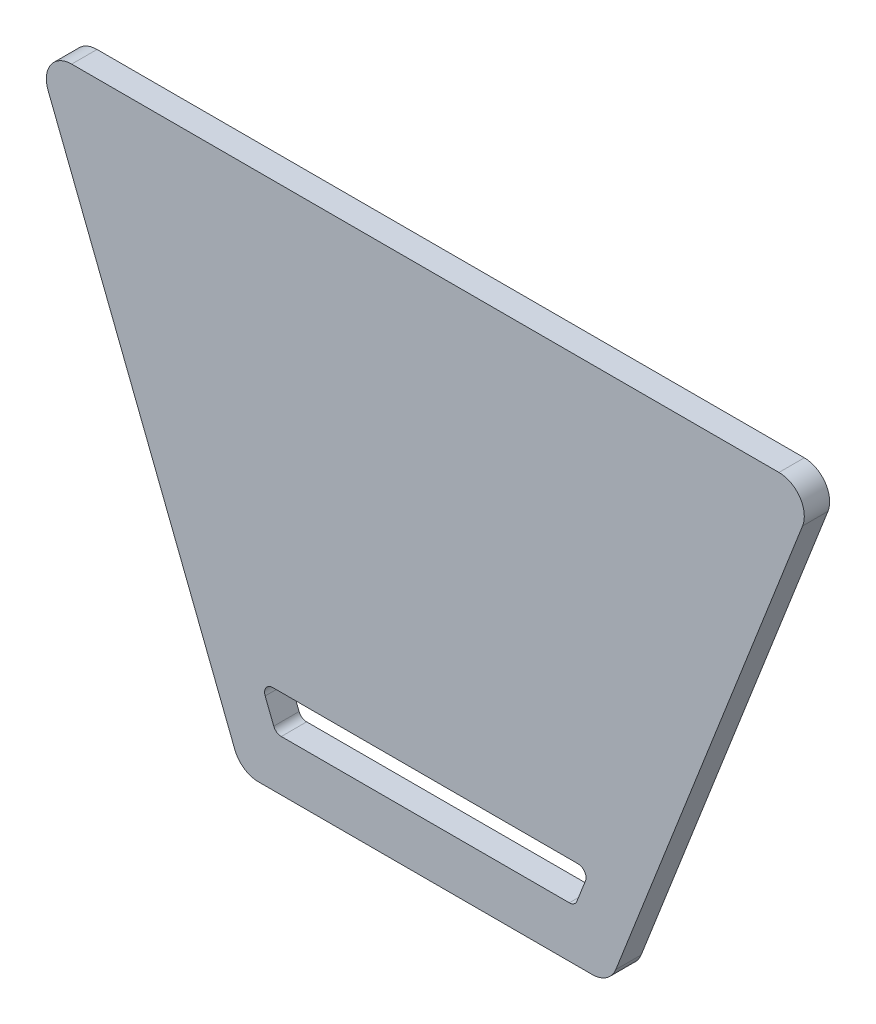
ISO-10303-21;
HEADER;
FILE_DESCRIPTION(('STEP AP214'),'2;1');
FILE_NAME('part.step','',(''),(''),'','','');
FILE_SCHEMA(('AUTOMOTIVE_DESIGN { 1 0 10303 214 1 1 1 1 }'));
ENDSEC;
DATA;
#1=APPLICATION_CONTEXT('core data for automotive mechanical design processes');
#2=APPLICATION_PROTOCOL_DEFINITION('international standard','automotive_design',2000,#1);
#3=PRODUCT_CONTEXT('',#1,'mechanical');
#4=PRODUCT('Part','Part','',(#3));
#5=PRODUCT_RELATED_PRODUCT_CATEGORY('part','',(#4));
#6=PRODUCT_DEFINITION_FORMATION('','',#4);
#7=PRODUCT_DEFINITION_CONTEXT('part definition',#1,'design');
#8=PRODUCT_DEFINITION('design','',#6,#7);
#9=PRODUCT_DEFINITION_SHAPE('','',#8);
#10=(LENGTH_UNIT() NAMED_UNIT(*) SI_UNIT(.MILLI.,.METRE.));
#11=(NAMED_UNIT(*) PLANE_ANGLE_UNIT() SI_UNIT($,.RADIAN.));
#12=(NAMED_UNIT(*) SI_UNIT($,.STERADIAN.) SOLID_ANGLE_UNIT());
#13=UNCERTAINTY_MEASURE_WITH_UNIT(LENGTH_MEASURE(1.E-05),#10,'distance_accuracy_value','');
#14=(GEOMETRIC_REPRESENTATION_CONTEXT(3) GLOBAL_UNCERTAINTY_ASSIGNED_CONTEXT((#13)) GLOBAL_UNIT_ASSIGNED_CONTEXT((#10,
#11,#12)) REPRESENTATION_CONTEXT('',''));
#15=CARTESIAN_POINT('',(0.,0.,0.));
#16=DIRECTION('',(0.,0.,1.));
#17=DIRECTION('',(1.,0.,0.));
#18=AXIS2_PLACEMENT_3D('',#15,#16,#17);
#19=CARTESIAN_POINT('',(2.64081387947168,3.17499999999996,-3.175));
#20=DIRECTION('',(0.,0.,1.));
#21=DIRECTION('',(1.,0.,0.));
#22=AXIS2_PLACEMENT_3D('',#19,#20,#21);
#23=PLANE('',#22);
#24=CARTESIAN_POINT('',(2.64081387947168,3.17499999999996,-3.175));
#25=DIRECTION('',(0.,0.,1.));
#26=DIRECTION('',(1.,0.,0.));
#27=AXIS2_PLACEMENT_3D('',#24,#25,#26);
#28=CIRCLE('',#27,3.175);
#29=CARTESIAN_POINT('',(2.64081387947167,0.,-3.175));
#30=VERTEX_POINT('',#29);
#31=CARTESIAN_POINT('',(5.59773660978438,2.01861210359144,-3.175));
#32=VERTEX_POINT('',#31);
#33=EDGE_CURVE('E240',#30,#32,#28,.T.);
#34=ORIENTED_EDGE('',*,*,#33,.F.);
#35=DIRECTION('',(1.,0.,0.));
#36=VECTOR('',#35,1.);
#37=CARTESIAN_POINT('',(-18.2570910649843,0.,-3.175));
#38=LINE('',#37,#36);
#39=CARTESIAN_POINT('',(-39.1549960094402,0.,-3.175));
#40=VERTEX_POINT('',#39);
#41=EDGE_CURVE('E252',#40,#30,#38,.T.);
#42=ORIENTED_EDGE('',*,*,#41,.F.);
#43=CARTESIAN_POINT('',(-39.1549960094402,3.17499999999996,-3.175));
#44=DIRECTION('',(0.,0.,-1.));
#45=DIRECTION('',(-1.,0.,0.));
#46=AXIS2_PLACEMENT_3D('',#43,#44,#45);
#47=CIRCLE('',#46,3.175);
#48=CARTESIAN_POINT('',(-42.1119187397529,2.01861210359144,-3.175));
#49=VERTEX_POINT('',#48);
#50=EDGE_CURVE('E212',#40,#49,#47,.T.);
#51=ORIENTED_EDGE('',*,*,#50,.T.);
#52=DIRECTION('',(-0.364216660286154,0.931314245767775,0.));
#53=VECTOR('',#52,1.);
#54=CARTESIAN_POINT('',(-65.4972345321023,61.815650827965,-3.175));
#55=LINE('',#54,#53);
#56=CARTESIAN_POINT('',(-65.4972345321023,61.815650827965,-3.175));
#57=VERTEX_POINT('',#56);
#58=EDGE_CURVE('E215',#49,#57,#55,.T.);
#59=ORIENTED_EDGE('',*,*,#58,.T.);
#60=CARTESIAN_POINT('',(-62.5403118017896,62.9720387243736,-3.175));
#61=DIRECTION('',(0.,0.,-1.));
#62=DIRECTION('',(1.,0.,0.));
#63=AXIS2_PLACEMENT_3D('',#60,#61,#62);
#64=CIRCLE('',#63,3.175);
#65=CARTESIAN_POINT('',(-62.5403118017896,66.1470387243736,-3.175));
#66=VERTEX_POINT('',#65);
#67=EDGE_CURVE('E218',#57,#66,#64,.T.);
#68=ORIENTED_EDGE('',*,*,#67,.T.);
#69=DIRECTION('',(-1.,0.,0.));
#70=VECTOR('',#69,1.);
#71=CARTESIAN_POINT('',(-18.2570910649843,66.1470387243736,-3.175));
#72=LINE('',#71,#70);
#73=CARTESIAN_POINT('',(26.0261296718211,66.1470387243736,-3.175));
#74=VERTEX_POINT('',#73);
#75=EDGE_CURVE('E250',#74,#66,#72,.T.);
#76=ORIENTED_EDGE('',*,*,#75,.F.);
#77=CARTESIAN_POINT('',(26.0261296718211,62.9720387243736,-3.175));
#78=DIRECTION('',(0.,0.,1.));
#79=DIRECTION('',(-1.,0.,0.));
#80=AXIS2_PLACEMENT_3D('',#77,#78,#79);
#81=CIRCLE('',#80,3.175);
#82=CARTESIAN_POINT('',(28.9830524021338,61.815650827965,-3.175));
#83=VERTEX_POINT('',#82);
#84=EDGE_CURVE('E247',#83,#74,#81,.T.);
#85=ORIENTED_EDGE('',*,*,#84,.F.);
#86=DIRECTION('',(0.364216660286154,0.931314245767775,0.));
#87=VECTOR('',#86,1.);
#88=CARTESIAN_POINT('',(28.9830524021338,61.815650827965,-3.175));
#89=LINE('',#88,#87);
#90=EDGE_CURVE('E243',#32,#83,#89,.T.);
#91=ORIENTED_EDGE('',*,*,#90,.F.);
#92=EDGE_LOOP('',(#34,#42,#51,#59,#68,#76,#85,#91));
#93=FACE_BOUND('',#92,.T.);
#94=CARTESIAN_POINT('',(-36.2939123431595,7.366,-3.175));
#95=DIRECTION('',(0.,0.,-1.));
#96=DIRECTION('',(-1.,0.,0.));
#97=AXIS2_PLACEMENT_3D('',#94,#95,#96);
#98=CIRCLE('',#97,1.016);
#99=CARTESIAN_POINT('',(-36.2939123431595,6.35,-3.175));
#100=VERTEX_POINT('',#99);
#101=CARTESIAN_POINT('',(-37.2401276168596,6.99595587314927,-3.175));
#102=VERTEX_POINT('',#101);
#103=EDGE_CURVE('E144',#100,#102,#98,.T.);
#104=ORIENTED_EDGE('',*,*,#103,.F.);
#105=DIRECTION('',(1.,0.,0.));
#106=VECTOR('',#105,1.);
#107=CARTESIAN_POINT('',(-36.2939123431595,6.35,-3.175));
#108=LINE('',#107,#106);
#109=CARTESIAN_POINT('',(-0.22026978680902,6.35,-3.175));
#110=VERTEX_POINT('',#109);
#111=EDGE_CURVE('E179',#100,#110,#108,.T.);
#112=ORIENTED_EDGE('',*,*,#111,.T.);
#113=CARTESIAN_POINT('',(-0.22026978680902,7.366,-3.175));
#114=DIRECTION('',(0.,0.,1.));
#115=DIRECTION('',(1.,0.,0.));
#116=AXIS2_PLACEMENT_3D('',#113,#114,#115);
#117=CIRCLE('',#116,1.016);
#118=CARTESIAN_POINT('',(0.725945486891039,6.99595587314927,-3.175));
#119=VERTEX_POINT('',#118);
#120=EDGE_CURVE('E48',#110,#119,#117,.T.);
#121=ORIENTED_EDGE('',*,*,#120,.T.);
#122=DIRECTION('',(0.364216660286153,0.931314245767776,0.));
#123=VECTOR('',#122,1.);
#124=CARTESIAN_POINT('',(0.72594548689104,6.99595587314927,-3.175));
#125=LINE('',#124,#123);
#126=CARTESIAN_POINT('',(1.79875109148404,9.73915587314927,-3.175));
#127=VERTEX_POINT('',#126);
#128=EDGE_CURVE('E175',#119,#127,#125,.T.);
#129=ORIENTED_EDGE('',*,*,#128,.T.);
#130=CARTESIAN_POINT('',(0.852535817783985,10.1092,-3.175));
#131=DIRECTION('',(0.,0.,1.));
#132=DIRECTION('',(1.,0.,0.));
#133=AXIS2_PLACEMENT_3D('',#130,#131,#132);
#134=CIRCLE('',#133,1.016);
#135=CARTESIAN_POINT('',(0.852535817783985,11.1252,-3.175));
#136=VERTEX_POINT('',#135);
#137=EDGE_CURVE('E172',#127,#136,#134,.T.);
#138=ORIENTED_EDGE('',*,*,#137,.T.);
#139=DIRECTION('',(-1.,0.,0.));
#140=VECTOR('',#139,1.);
#141=CARTESIAN_POINT('',(0.852535817783985,11.1252,-3.175));
#142=LINE('',#141,#140);
#143=CARTESIAN_POINT('',(-37.3667179477525,11.1252,-3.175));
#144=VERTEX_POINT('',#143);
#145=EDGE_CURVE('E168',#136,#144,#142,.T.);
#146=ORIENTED_EDGE('',*,*,#145,.T.);
#147=CARTESIAN_POINT('',(-37.3667179477525,10.1092,-3.175));
#148=DIRECTION('',(0.,0.,-1.));
#149=DIRECTION('',(-1.,0.,0.));
#150=AXIS2_PLACEMENT_3D('',#147,#148,#149);
#151=CIRCLE('',#150,1.016);
#152=CARTESIAN_POINT('',(-38.3129332214526,9.73915587314927,-3.175));
#153=VERTEX_POINT('',#152);
#154=EDGE_CURVE('E166',#153,#144,#151,.T.);
#155=ORIENTED_EDGE('',*,*,#154,.F.);
#156=DIRECTION('',(-0.364216660286153,0.931314245767776,0.));
#157=VECTOR('',#156,1.);
#158=CARTESIAN_POINT('',(-37.2401276168596,6.99595587314927,-3.175));
#159=LINE('',#158,#157);
#160=EDGE_CURVE('E153',#102,#153,#159,.T.);
#161=ORIENTED_EDGE('',*,*,#160,.F.);
#162=EDGE_LOOP('',(#104,#112,#121,#129,#138,#146,#155,#161));
#163=FACE_BOUND('',#162,.T.);
#164=ADVANCED_FACE('F31',(#93,#163),#23,.F.);
#165=CARTESIAN_POINT('',(2.64081387947168,3.17499999999996,0.));
#166=DIRECTION('',(0.,0.,1.));
#167=DIRECTION('',(1.,0.,0.));
#168=AXIS2_PLACEMENT_3D('',#165,#166,#167);
#169=PLANE('',#168);
#170=CARTESIAN_POINT('',(2.64081387947168,3.17499999999996,0.));
#171=DIRECTION('',(0.,0.,1.));
#172=DIRECTION('',(1.,0.,0.));
#173=AXIS2_PLACEMENT_3D('',#170,#171,#172);
#174=CIRCLE('',#173,3.175);
#175=CARTESIAN_POINT('',(2.64081387947167,0.,0.));
#176=VERTEX_POINT('',#175);
#177=CARTESIAN_POINT('',(5.59773660978438,2.01861210359144,0.));
#178=VERTEX_POINT('',#177);
#179=EDGE_CURVE('E231',#176,#178,#174,.T.);
#180=ORIENTED_EDGE('',*,*,#179,.T.);
#181=DIRECTION('',(0.364216660286154,0.931314245767775,0.));
#182=VECTOR('',#181,1.);
#183=CARTESIAN_POINT('',(28.9830524021338,61.815650827965,0.));
#184=LINE('',#183,#182);
#185=CARTESIAN_POINT('',(28.9830524021338,61.815650827965,0.));
#186=VERTEX_POINT('',#185);
#187=EDGE_CURVE('E257',#178,#186,#184,.T.);
#188=ORIENTED_EDGE('',*,*,#187,.T.);
#189=CARTESIAN_POINT('',(26.0261296718211,62.9720387243736,0.));
#190=DIRECTION('',(0.,0.,1.));
#191=DIRECTION('',(-1.,0.,0.));
#192=AXIS2_PLACEMENT_3D('',#189,#190,#191);
#193=CIRCLE('',#192,3.175);
#194=CARTESIAN_POINT('',(26.0261296718211,66.1470387243736,0.));
#195=VERTEX_POINT('',#194);
#196=EDGE_CURVE('E260',#186,#195,#193,.T.);
#197=ORIENTED_EDGE('',*,*,#196,.T.);
#198=DIRECTION('',(-1.,0.,0.));
#199=VECTOR('',#198,1.);
#200=CARTESIAN_POINT('',(-18.2570910649843,66.1470387243736,0.));
#201=LINE('',#200,#199);
#202=CARTESIAN_POINT('',(-62.5403118017896,66.1470387243736,0.));
#203=VERTEX_POINT('',#202);
#204=EDGE_CURVE('E263',#195,#203,#201,.T.);
#205=ORIENTED_EDGE('',*,*,#204,.T.);
#206=CARTESIAN_POINT('',(-62.5403118017896,62.9720387243736,0.));
#207=DIRECTION('',(0.,0.,-1.));
#208=DIRECTION('',(1.,0.,0.));
#209=AXIS2_PLACEMENT_3D('',#206,#207,#208);
#210=CIRCLE('',#209,3.175);
#211=CARTESIAN_POINT('',(-65.4972345321023,61.815650827965,0.));
#212=VERTEX_POINT('',#211);
#213=EDGE_CURVE('E216',#212,#203,#210,.T.);
#214=ORIENTED_EDGE('',*,*,#213,.F.);
#215=DIRECTION('',(-0.364216660286154,0.931314245767775,0.));
#216=VECTOR('',#215,1.);
#217=CARTESIAN_POINT('',(-65.4972345321023,61.815650827965,0.));
#218=LINE('',#217,#216);
#219=CARTESIAN_POINT('',(-42.1119187397529,2.01861210359144,0.));
#220=VERTEX_POINT('',#219);
#221=EDGE_CURVE('E224',#220,#212,#218,.T.);
#222=ORIENTED_EDGE('',*,*,#221,.F.);
#223=CARTESIAN_POINT('',(-39.1549960094402,3.17499999999996,0.));
#224=DIRECTION('',(0.,0.,-1.));
#225=DIRECTION('',(-1.,0.,0.));
#226=AXIS2_PLACEMENT_3D('',#223,#224,#225);
#227=CIRCLE('',#226,3.175);
#228=CARTESIAN_POINT('',(-39.1549960094402,0.,0.));
#229=VERTEX_POINT('',#228);
#230=EDGE_CURVE('E161',#229,#220,#227,.T.);
#231=ORIENTED_EDGE('',*,*,#230,.F.);
#232=DIRECTION('',(1.,0.,0.));
#233=VECTOR('',#232,1.);
#234=CARTESIAN_POINT('',(-18.2570910649843,0.,0.));
#235=LINE('',#234,#233);
#236=EDGE_CURVE('E244',#229,#176,#235,.T.);
#237=ORIENTED_EDGE('',*,*,#236,.T.);
#238=EDGE_LOOP('',(#180,#188,#197,#205,#214,#222,#231,#237));
#239=FACE_BOUND('',#238,.T.);
#240=DIRECTION('',(1.,0.,0.));
#241=VECTOR('',#240,1.);
#242=CARTESIAN_POINT('',(-36.2939123431595,6.35,0.));
#243=LINE('',#242,#241);
#244=CARTESIAN_POINT('',(-36.2939123431595,6.35,0.));
#245=VERTEX_POINT('',#244);
#246=CARTESIAN_POINT('',(-0.22026978680902,6.35,0.));
#247=VERTEX_POINT('',#246);
#248=EDGE_CURVE('E154',#245,#247,#243,.T.);
#249=ORIENTED_EDGE('',*,*,#248,.F.);
#250=CARTESIAN_POINT('',(-36.2939123431595,7.366,0.));
#251=DIRECTION('',(0.,0.,-1.));
#252=DIRECTION('',(-1.,0.,0.));
#253=AXIS2_PLACEMENT_3D('',#250,#251,#252);
#254=CIRCLE('',#253,1.016);
#255=CARTESIAN_POINT('',(-37.2401276168596,6.99595587314927,0.));
#256=VERTEX_POINT('',#255);
#257=EDGE_CURVE('E56',#245,#256,#254,.T.);
#258=ORIENTED_EDGE('',*,*,#257,.T.);
#259=DIRECTION('',(-0.364216660286153,0.931314245767776,0.));
#260=VECTOR('',#259,1.);
#261=CARTESIAN_POINT('',(-37.2401276168596,6.99595587314927,0.));
#262=LINE('',#261,#260);
#263=CARTESIAN_POINT('',(-38.3129332214526,9.73915587314927,0.));
#264=VERTEX_POINT('',#263);
#265=EDGE_CURVE('E160',#256,#264,#262,.T.);
#266=ORIENTED_EDGE('',*,*,#265,.T.);
#267=CARTESIAN_POINT('',(-37.3667179477525,10.1092,0.));
#268=DIRECTION('',(0.,0.,-1.));
#269=DIRECTION('',(-1.,0.,0.));
#270=AXIS2_PLACEMENT_3D('',#267,#268,#269);
#271=CIRCLE('',#270,1.016);
#272=CARTESIAN_POINT('',(-37.3667179477525,11.1252,0.));
#273=VERTEX_POINT('',#272);
#274=EDGE_CURVE('E183',#264,#273,#271,.T.);
#275=ORIENTED_EDGE('',*,*,#274,.T.);
#276=DIRECTION('',(-1.,0.,0.));
#277=VECTOR('',#276,1.);
#278=CARTESIAN_POINT('',(0.852535817783985,11.1252,0.));
#279=LINE('',#278,#277);
#280=CARTESIAN_POINT('',(0.852535817783985,11.1252,0.));
#281=VERTEX_POINT('',#280);
#282=EDGE_CURVE('E186',#281,#273,#279,.T.);
#283=ORIENTED_EDGE('',*,*,#282,.F.);
#284=CARTESIAN_POINT('',(0.852535817783985,10.1092,0.));
#285=DIRECTION('',(0.,0.,1.));
#286=DIRECTION('',(1.,0.,0.));
#287=AXIS2_PLACEMENT_3D('',#284,#285,#286);
#288=CIRCLE('',#287,1.016);
#289=CARTESIAN_POINT('',(1.79875109148404,9.73915587314927,0.));
#290=VERTEX_POINT('',#289);
#291=EDGE_CURVE('E189',#290,#281,#288,.T.);
#292=ORIENTED_EDGE('',*,*,#291,.F.);
#293=DIRECTION('',(0.364216660286153,0.931314245767776,0.));
#294=VECTOR('',#293,1.);
#295=CARTESIAN_POINT('',(0.72594548689104,6.99595587314927,0.));
#296=LINE('',#295,#294);
#297=CARTESIAN_POINT('',(0.725945486891039,6.99595587314927,0.));
#298=VERTEX_POINT('',#297);
#299=EDGE_CURVE('E192',#298,#290,#296,.T.);
#300=ORIENTED_EDGE('',*,*,#299,.F.);
#301=CARTESIAN_POINT('',(-0.22026978680902,7.366,0.));
#302=DIRECTION('',(0.,0.,1.));
#303=DIRECTION('',(1.,0.,0.));
#304=AXIS2_PLACEMENT_3D('',#301,#302,#303);
#305=CIRCLE('',#304,1.016);
#306=EDGE_CURVE('E195',#247,#298,#305,.T.);
#307=ORIENTED_EDGE('',*,*,#306,.F.);
#308=EDGE_LOOP('',(#249,#258,#266,#275,#283,#292,#300,#307));
#309=FACE_BOUND('',#308,.T.);
#310=ADVANCED_FACE('F277',(#239,#309),#169,.T.);
#311=CARTESIAN_POINT('',(2.64081387947168,3.17499999999996,-3.175));
#312=DIRECTION('',(0.,0.,1.));
#313=DIRECTION('',(1.,0.,0.));
#314=AXIS2_PLACEMENT_3D('',#311,#312,#313);
#315=CYLINDRICAL_SURFACE('',#314,3.175);
#316=ORIENTED_EDGE('',*,*,#179,.F.);
#317=DIRECTION('',(0.,0.,1.));
#318=VECTOR('',#317,1.);
#319=CARTESIAN_POINT('',(2.64081387947167,0.,-3.175));
#320=LINE('',#319,#318);
#321=EDGE_CURVE('E11',#30,#176,#320,.T.);
#322=ORIENTED_EDGE('',*,*,#321,.F.);
#323=ORIENTED_EDGE('',*,*,#33,.T.);
#324=DIRECTION('',(0.,0.,1.));
#325=VECTOR('',#324,1.);
#326=CARTESIAN_POINT('',(5.59773660978438,2.01861210359144,-3.175));
#327=LINE('',#326,#325);
#328=EDGE_CURVE('E35',#32,#178,#327,.T.);
#329=ORIENTED_EDGE('',*,*,#328,.T.);
#330=EDGE_LOOP('',(#316,#322,#323,#329));
#331=FACE_BOUND('',#330,.T.);
#332=ADVANCED_FACE('F33',(#331),#315,.T.);
#333=CARTESIAN_POINT('',(-18.2570910649843,0.,-3.175));
#334=DIRECTION('',(0.,-1.,0.));
#335=DIRECTION('',(1.,0.,0.));
#336=AXIS2_PLACEMENT_3D('',#333,#334,#335);
#337=PLANE('',#336);
#338=ORIENTED_EDGE('',*,*,#236,.F.);
#339=DIRECTION('',(0.,0.,1.));
#340=VECTOR('',#339,1.);
#341=CARTESIAN_POINT('',(-39.1549960094402,0.,-3.175));
#342=LINE('',#341,#340);
#343=EDGE_CURVE('E228',#40,#229,#342,.T.);
#344=ORIENTED_EDGE('',*,*,#343,.F.);
#345=ORIENTED_EDGE('',*,*,#41,.T.);
#346=ORIENTED_EDGE('',*,*,#321,.T.);
#347=EDGE_LOOP('',(#338,#344,#345,#346));
#348=FACE_BOUND('',#347,.T.);
#349=ADVANCED_FACE('F282',(#348),#337,.T.);
#350=CARTESIAN_POINT('',(-18.2570910649843,66.1470387243736,-3.175));
#351=DIRECTION('',(0.,1.,0.));
#352=DIRECTION('',(0.,0.,1.));
#353=AXIS2_PLACEMENT_3D('',#350,#351,#352);
#354=PLANE('',#353);
#355=ORIENTED_EDGE('',*,*,#204,.F.);
#356=DIRECTION('',(0.,0.,1.));
#357=VECTOR('',#356,1.);
#358=CARTESIAN_POINT('',(26.0261296718211,66.1470387243736,-3.175));
#359=LINE('',#358,#357);
#360=EDGE_CURVE('E40',#74,#195,#359,.T.);
#361=ORIENTED_EDGE('',*,*,#360,.F.);
#362=ORIENTED_EDGE('',*,*,#75,.T.);
#363=DIRECTION('',(0.,0.,1.));
#364=VECTOR('',#363,1.);
#365=CARTESIAN_POINT('',(-62.5403118017896,66.1470387243736,-3.175));
#366=LINE('',#365,#364);
#367=EDGE_CURVE('E232',#66,#203,#366,.T.);
#368=ORIENTED_EDGE('',*,*,#367,.T.);
#369=EDGE_LOOP('',(#355,#361,#362,#368));
#370=FACE_BOUND('',#369,.T.);
#371=ADVANCED_FACE('F300',(#370),#354,.T.);
#372=CARTESIAN_POINT('',(26.0261296718211,62.9720387243736,-3.175));
#373=DIRECTION('',(0.,0.,1.));
#374=DIRECTION('',(1.,0.,0.));
#375=AXIS2_PLACEMENT_3D('',#372,#373,#374);
#376=CYLINDRICAL_SURFACE('',#375,3.175);
#377=ORIENTED_EDGE('',*,*,#196,.F.);
#378=DIRECTION('',(0.,0.,1.));
#379=VECTOR('',#378,1.);
#380=CARTESIAN_POINT('',(28.9830524021338,61.815650827965,-3.175));
#381=LINE('',#380,#379);
#382=EDGE_CURVE('E267',#83,#186,#381,.T.);
#383=ORIENTED_EDGE('',*,*,#382,.F.);
#384=ORIENTED_EDGE('',*,*,#84,.T.);
#385=ORIENTED_EDGE('',*,*,#360,.T.);
#386=EDGE_LOOP('',(#377,#383,#384,#385));
#387=FACE_BOUND('',#386,.T.);
#388=ADVANCED_FACE('F292',(#387),#376,.T.);
#389=CARTESIAN_POINT('',(28.9830524021338,61.815650827965,-3.175));
#390=DIRECTION('',(0.931314245767775,-0.364216660286154,0.));
#391=DIRECTION('',(0.364216660286154,0.931314245767776,0.));
#392=AXIS2_PLACEMENT_3D('',#389,#390,#391);
#393=PLANE('',#392);
#394=ORIENTED_EDGE('',*,*,#187,.F.);
#395=ORIENTED_EDGE('',*,*,#328,.F.);
#396=ORIENTED_EDGE('',*,*,#90,.T.);
#397=ORIENTED_EDGE('',*,*,#382,.T.);
#398=EDGE_LOOP('',(#394,#395,#396,#397));
#399=FACE_BOUND('',#398,.T.);
#400=ADVANCED_FACE('F275',(#399),#393,.T.);
#401=CARTESIAN_POINT('',(-39.1549960094402,3.17499999999996,-3.175));
#402=DIRECTION('',(0.,0.,1.));
#403=DIRECTION('',(-1.,0.,0.));
#404=AXIS2_PLACEMENT_3D('',#401,#402,#403);
#405=CYLINDRICAL_SURFACE('',#404,3.175);
#406=ORIENTED_EDGE('',*,*,#230,.T.);
#407=DIRECTION('',(0.,0.,1.));
#408=VECTOR('',#407,1.);
#409=CARTESIAN_POINT('',(-42.1119187397529,2.01861210359144,-3.175));
#410=LINE('',#409,#408);
#411=EDGE_CURVE('E221',#49,#220,#410,.T.);
#412=ORIENTED_EDGE('',*,*,#411,.F.);
#413=ORIENTED_EDGE('',*,*,#50,.F.);
#414=ORIENTED_EDGE('',*,*,#343,.T.);
#415=EDGE_LOOP('',(#406,#412,#413,#414));
#416=FACE_BOUND('',#415,.T.);
#417=ADVANCED_FACE('F285',(#416),#405,.T.);
#418=CARTESIAN_POINT('',(-62.5403118017896,62.9720387243736,-3.175));
#419=DIRECTION('',(0.,0.,1.));
#420=DIRECTION('',(-1.,0.,0.));
#421=AXIS2_PLACEMENT_3D('',#418,#419,#420);
#422=CYLINDRICAL_SURFACE('',#421,3.175);
#423=ORIENTED_EDGE('',*,*,#213,.T.);
#424=ORIENTED_EDGE('',*,*,#367,.F.);
#425=ORIENTED_EDGE('',*,*,#67,.F.);
#426=DIRECTION('',(0.,0.,1.));
#427=VECTOR('',#426,1.);
#428=CARTESIAN_POINT('',(-65.4972345321023,61.815650827965,-3.175));
#429=LINE('',#428,#427);
#430=EDGE_CURVE('E235',#57,#212,#429,.T.);
#431=ORIENTED_EDGE('',*,*,#430,.T.);
#432=EDGE_LOOP('',(#423,#424,#425,#431));
#433=FACE_BOUND('',#432,.T.);
#434=ADVANCED_FACE('F298',(#433),#422,.T.);
#435=CARTESIAN_POINT('',(-65.4972345321023,61.815650827965,-3.175));
#436=DIRECTION('',(-0.931314245767775,-0.364216660286154,0.));
#437=DIRECTION('',(-0.364216660286154,0.931314245767776,0.));
#438=AXIS2_PLACEMENT_3D('',#435,#436,#437);
#439=PLANE('',#438);
#440=ORIENTED_EDGE('',*,*,#221,.T.);
#441=ORIENTED_EDGE('',*,*,#430,.F.);
#442=ORIENTED_EDGE('',*,*,#58,.F.);
#443=ORIENTED_EDGE('',*,*,#411,.T.);
#444=EDGE_LOOP('',(#440,#441,#442,#443));
#445=FACE_BOUND('',#444,.T.);
#446=ADVANCED_FACE('F318',(#445),#439,.T.);
#447=CARTESIAN_POINT('',(-36.2939123431595,7.366,-3.175));
#448=DIRECTION('',(0.,0.,1.));
#449=DIRECTION('',(1.,0.,0.));
#450=AXIS2_PLACEMENT_3D('',#447,#448,#449);
#451=CYLINDRICAL_SURFACE('',#450,1.016);
#452=ORIENTED_EDGE('',*,*,#257,.F.);
#453=DIRECTION('',(0.,0.,1.));
#454=VECTOR('',#453,1.);
#455=CARTESIAN_POINT('',(-36.2939123431595,6.35,-3.175));
#456=LINE('',#455,#454);
#457=EDGE_CURVE('E148',#100,#245,#456,.T.);
#458=ORIENTED_EDGE('',*,*,#457,.F.);
#459=ORIENTED_EDGE('',*,*,#103,.T.);
#460=DIRECTION('',(0.,0.,1.));
#461=VECTOR('',#460,1.);
#462=CARTESIAN_POINT('',(-37.2401276168596,6.99595587314927,-3.175));
#463=LINE('',#462,#461);
#464=EDGE_CURVE('E147',#102,#256,#463,.T.);
#465=ORIENTED_EDGE('',*,*,#464,.T.);
#466=EDGE_LOOP('',(#452,#458,#459,#465));
#467=FACE_BOUND('',#466,.T.);
#468=ADVANCED_FACE('F146',(#467),#451,.F.);
#469=CARTESIAN_POINT('',(-37.2401276168596,6.99595587314927,-3.175));
#470=DIRECTION('',(0.931314245767776,0.364216660286153,0.));
#471=DIRECTION('',(-0.364216660286153,0.931314245767776,0.));
#472=AXIS2_PLACEMENT_3D('',#469,#470,#471);
#473=PLANE('',#472);
#474=ORIENTED_EDGE('',*,*,#265,.F.);
#475=ORIENTED_EDGE('',*,*,#464,.F.);
#476=ORIENTED_EDGE('',*,*,#160,.T.);
#477=DIRECTION('',(0.,0.,1.));
#478=VECTOR('',#477,1.);
#479=CARTESIAN_POINT('',(-38.3129332214526,9.73915587314927,-3.175));
#480=LINE('',#479,#478);
#481=EDGE_CURVE('E162',#153,#264,#480,.T.);
#482=ORIENTED_EDGE('',*,*,#481,.T.);
#483=EDGE_LOOP('',(#474,#475,#476,#482));
#484=FACE_BOUND('',#483,.T.);
#485=ADVANCED_FACE('F157',(#484),#473,.T.);
#486=CARTESIAN_POINT('',(-37.3667179477525,10.1092,-3.175));
#487=DIRECTION('',(0.,0.,1.));
#488=DIRECTION('',(1.,0.,0.));
#489=AXIS2_PLACEMENT_3D('',#486,#487,#488);
#490=CYLINDRICAL_SURFACE('',#489,1.016);
#491=ORIENTED_EDGE('',*,*,#274,.F.);
#492=ORIENTED_EDGE('',*,*,#481,.F.);
#493=ORIENTED_EDGE('',*,*,#154,.T.);
#494=DIRECTION('',(0.,0.,1.));
#495=VECTOR('',#494,1.);
#496=CARTESIAN_POINT('',(-37.3667179477525,11.1252,-3.175));
#497=LINE('',#496,#495);
#498=EDGE_CURVE('E209',#144,#273,#497,.T.);
#499=ORIENTED_EDGE('',*,*,#498,.T.);
#500=EDGE_LOOP('',(#491,#492,#493,#499));
#501=FACE_BOUND('',#500,.T.);
#502=ADVANCED_FACE('F328',(#501),#490,.F.);
#503=CARTESIAN_POINT('',(0.852535817783985,11.1252,-3.175));
#504=DIRECTION('',(0.,1.,0.));
#505=DIRECTION('',(0.,0.,1.));
#506=AXIS2_PLACEMENT_3D('',#503,#504,#505);
#507=PLANE('',#506);
#508=ORIENTED_EDGE('',*,*,#282,.T.);
#509=ORIENTED_EDGE('',*,*,#498,.F.);
#510=ORIENTED_EDGE('',*,*,#145,.F.);
#511=DIRECTION('',(0.,0.,1.));
#512=VECTOR('',#511,1.);
#513=CARTESIAN_POINT('',(0.852535817783985,11.1252,-3.175));
#514=LINE('',#513,#512);
#515=EDGE_CURVE('E207',#136,#281,#514,.T.);
#516=ORIENTED_EDGE('',*,*,#515,.T.);
#517=EDGE_LOOP('',(#508,#509,#510,#516));
#518=FACE_BOUND('',#517,.T.);
#519=ADVANCED_FACE('F331',(#518),#507,.F.);
#520=CARTESIAN_POINT('',(0.852535817783985,10.1092,-3.175));
#521=DIRECTION('',(0.,0.,1.));
#522=DIRECTION('',(1.,0.,0.));
#523=AXIS2_PLACEMENT_3D('',#520,#521,#522);
#524=CYLINDRICAL_SURFACE('',#523,1.016);
#525=ORIENTED_EDGE('',*,*,#291,.T.);
#526=ORIENTED_EDGE('',*,*,#515,.F.);
#527=ORIENTED_EDGE('',*,*,#137,.F.);
#528=DIRECTION('',(0.,0.,1.));
#529=VECTOR('',#528,1.);
#530=CARTESIAN_POINT('',(1.79875109148404,9.73915587314927,-3.175));
#531=LINE('',#530,#529);
#532=EDGE_CURVE('E205',#127,#290,#531,.T.);
#533=ORIENTED_EDGE('',*,*,#532,.T.);
#534=EDGE_LOOP('',(#525,#526,#527,#533));
#535=FACE_BOUND('',#534,.T.);
#536=ADVANCED_FACE('F335',(#535),#524,.F.);
#537=CARTESIAN_POINT('',(0.72594548689104,6.99595587314927,-3.175));
#538=DIRECTION('',(0.931314245767776,-0.364216660286153,0.));
#539=DIRECTION('',(0.364216660286153,0.931314245767776,0.));
#540=AXIS2_PLACEMENT_3D('',#537,#538,#539);
#541=PLANE('',#540);
#542=ORIENTED_EDGE('',*,*,#299,.T.);
#543=ORIENTED_EDGE('',*,*,#532,.F.);
#544=ORIENTED_EDGE('',*,*,#128,.F.);
#545=DIRECTION('',(0.,0.,1.));
#546=VECTOR('',#545,1.);
#547=CARTESIAN_POINT('',(0.725945486891039,6.99595587314927,-3.175));
#548=LINE('',#547,#546);
#549=EDGE_CURVE('E203',#119,#298,#548,.T.);
#550=ORIENTED_EDGE('',*,*,#549,.T.);
#551=EDGE_LOOP('',(#542,#543,#544,#550));
#552=FACE_BOUND('',#551,.T.);
#553=ADVANCED_FACE('F339',(#552),#541,.F.);
#554=CARTESIAN_POINT('',(-0.22026978680902,7.366,-3.175));
#555=DIRECTION('',(0.,0.,1.));
#556=DIRECTION('',(1.,0.,0.));
#557=AXIS2_PLACEMENT_3D('',#554,#555,#556);
#558=CYLINDRICAL_SURFACE('',#557,1.016);
#559=ORIENTED_EDGE('',*,*,#306,.T.);
#560=ORIENTED_EDGE('',*,*,#549,.F.);
#561=ORIENTED_EDGE('',*,*,#120,.F.);
#562=DIRECTION('',(0.,0.,1.));
#563=VECTOR('',#562,1.);
#564=CARTESIAN_POINT('',(-0.22026978680902,6.35,-3.175));
#565=LINE('',#564,#563);
#566=EDGE_CURVE('E201',#110,#247,#565,.T.);
#567=ORIENTED_EDGE('',*,*,#566,.T.);
#568=EDGE_LOOP('',(#559,#560,#561,#567));
#569=FACE_BOUND('',#568,.T.);
#570=ADVANCED_FACE('F343',(#569),#558,.F.);
#571=CARTESIAN_POINT('',(-36.2939123431595,6.35,-3.175));
#572=DIRECTION('',(0.,-1.,0.));
#573=DIRECTION('',(0.,0.,-1.));
#574=AXIS2_PLACEMENT_3D('',#571,#572,#573);
#575=PLANE('',#574);
#576=ORIENTED_EDGE('',*,*,#248,.T.);
#577=ORIENTED_EDGE('',*,*,#566,.F.);
#578=ORIENTED_EDGE('',*,*,#111,.F.);
#579=ORIENTED_EDGE('',*,*,#457,.T.);
#580=EDGE_LOOP('',(#576,#577,#578,#579));
#581=FACE_BOUND('',#580,.T.);
#582=ADVANCED_FACE('F347',(#581),#575,.F.);
#583=CLOSED_SHELL('',(#164,#310,#332,#349,#371,#388,#400,#417,#434,#446,#468,#485,#502,#519,
#536,#553,#570,#582));
#584=MANIFOLD_SOLID_BREP('B2',#583);
#585=ADVANCED_BREP_SHAPE_REPRESENTATION('',(#18,#584),#14);
#586=SHAPE_DEFINITION_REPRESENTATION(#9,#585);
ENDSEC;
END-ISO-10303-21;
